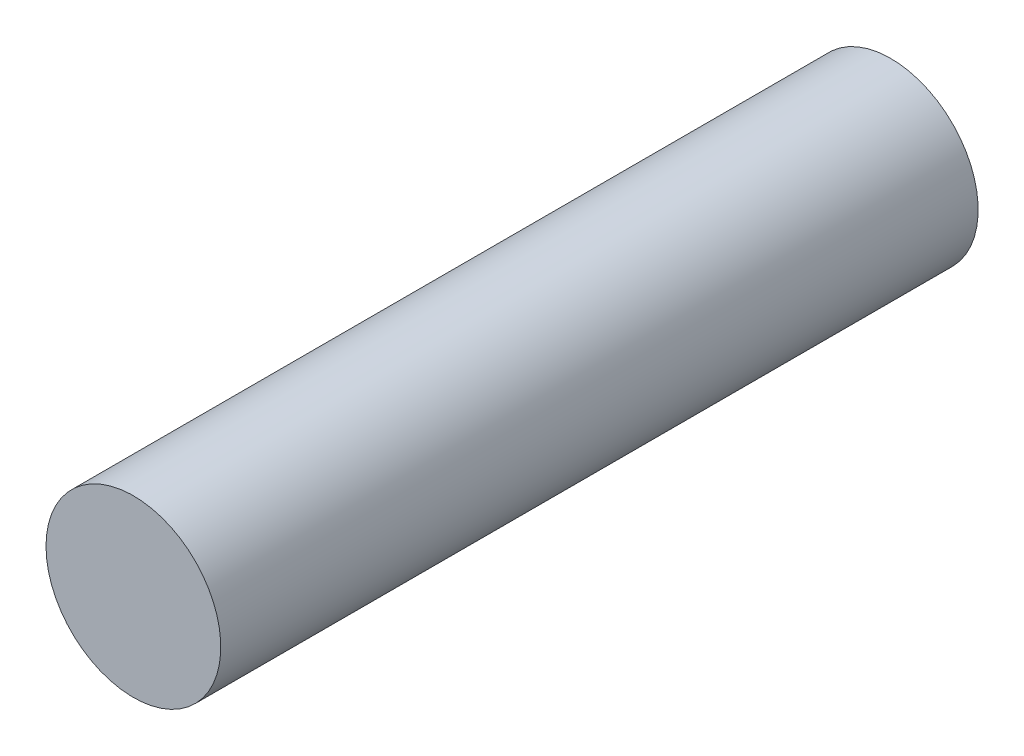
ISO-10303-21;
HEADER;
FILE_DESCRIPTION(('STEP AP214'),'2;1');
FILE_NAME('part.step','',(''),(''),'','','');
FILE_SCHEMA(('AUTOMOTIVE_DESIGN { 1 0 10303 214 1 1 1 1 }'));
ENDSEC;
DATA;
#1=APPLICATION_CONTEXT('core data for automotive mechanical design processes');
#2=APPLICATION_PROTOCOL_DEFINITION('international standard','automotive_design',2000,#1);
#3=PRODUCT_CONTEXT('',#1,'mechanical');
#4=PRODUCT('Part','Part','',(#3));
#5=PRODUCT_RELATED_PRODUCT_CATEGORY('part','',(#4));
#6=PRODUCT_DEFINITION_FORMATION('','',#4);
#7=PRODUCT_DEFINITION_CONTEXT('part definition',#1,'design');
#8=PRODUCT_DEFINITION('design','',#6,#7);
#9=PRODUCT_DEFINITION_SHAPE('','',#8);
#10=(LENGTH_UNIT() NAMED_UNIT(*) SI_UNIT(.MILLI.,.METRE.));
#11=(NAMED_UNIT(*) PLANE_ANGLE_UNIT() SI_UNIT($,.RADIAN.));
#12=(NAMED_UNIT(*) SI_UNIT($,.STERADIAN.) SOLID_ANGLE_UNIT());
#13=UNCERTAINTY_MEASURE_WITH_UNIT(LENGTH_MEASURE(1.E-05),#10,'distance_accuracy_value','');
#14=(GEOMETRIC_REPRESENTATION_CONTEXT(3) GLOBAL_UNCERTAINTY_ASSIGNED_CONTEXT((#13)) GLOBAL_UNIT_ASSIGNED_CONTEXT((#10,
#11,#12)) REPRESENTATION_CONTEXT('',''));
#15=CARTESIAN_POINT('',(0.,0.,0.));
#16=DIRECTION('',(0.,0.,1.));
#17=DIRECTION('',(1.,0.,0.));
#18=AXIS2_PLACEMENT_3D('',#15,#16,#17);
#19=CARTESIAN_POINT('',(0.,0.,165.1));
#20=DIRECTION('',(0.,0.,-1.));
#21=DIRECTION('',(-1.,0.,0.));
#22=AXIS2_PLACEMENT_3D('',#19,#20,#21);
#23=CYLINDRICAL_SURFACE('',#22,19.05);
#24=CARTESIAN_POINT('',(0.,0.,165.1));
#25=DIRECTION('',(0.,0.,1.));
#26=DIRECTION('',(1.,0.,0.));
#27=AXIS2_PLACEMENT_3D('',#24,#25,#26);
#28=CIRCLE('',#27,19.05);
#29=CARTESIAN_POINT('',(-19.05,0.,165.1));
#30=VERTEX_POINT('',#29);
#31=EDGE_CURVE('E10',#30,#30,#28,.T.);
#32=CARTESIAN_POINT('',(0.,0.,0.));
#33=DIRECTION('',(0.,0.,1.));
#34=DIRECTION('',(1.,0.,0.));
#35=AXIS2_PLACEMENT_3D('',#32,#33,#34);
#36=CIRCLE('',#35,19.05);
#37=CARTESIAN_POINT('',(-19.05,0.,0.));
#38=VERTEX_POINT('',#37);
#39=EDGE_CURVE('E38',#38,#38,#36,.T.);
#40=CARTESIAN_POINT('',(-19.05,0.,165.1));
#41=CARTESIAN_POINT('',(-19.05,0.,163.380208333333));
#42=CARTESIAN_POINT('',(-19.05,0.,161.660416666667));
#43=CARTESIAN_POINT('',(-19.05,0.,158.220833333333));
#44=CARTESIAN_POINT('',(-19.05,0.,156.501041666667));
#45=CARTESIAN_POINT('',(-19.05,0.,153.061458333333));
#46=CARTESIAN_POINT('',(-19.05,0.,151.341666666667));
#47=CARTESIAN_POINT('',(-19.05,0.,147.902083333333));
#48=CARTESIAN_POINT('',(-19.05,0.,146.182291666667));
#49=CARTESIAN_POINT('',(-19.05,0.,142.742708333333));
#50=CARTESIAN_POINT('',(-19.05,0.,141.022916666667));
#51=CARTESIAN_POINT('',(-19.05,0.,137.583333333333));
#52=CARTESIAN_POINT('',(-19.05,0.,135.863541666667));
#53=CARTESIAN_POINT('',(-19.05,0.,132.423958333333));
#54=CARTESIAN_POINT('',(-19.05,0.,130.704166666667));
#55=CARTESIAN_POINT('',(-19.05,0.,127.264583333333));
#56=CARTESIAN_POINT('',(-19.05,0.,125.544791666667));
#57=CARTESIAN_POINT('',(-19.05,0.,122.105208333333));
#58=CARTESIAN_POINT('',(-19.05,0.,120.385416666667));
#59=CARTESIAN_POINT('',(-19.05,0.,116.945833333333));
#60=CARTESIAN_POINT('',(-19.05,0.,115.226041666667));
#61=CARTESIAN_POINT('',(-19.05,0.,111.786458333333));
#62=CARTESIAN_POINT('',(-19.05,0.,110.066666666667));
#63=CARTESIAN_POINT('',(-19.05,0.,106.627083333333));
#64=CARTESIAN_POINT('',(-19.05,0.,104.907291666667));
#65=CARTESIAN_POINT('',(-19.05,0.,101.467708333333));
#66=CARTESIAN_POINT('',(-19.05,0.,99.7479166666666));
#67=CARTESIAN_POINT('',(-19.05,0.,96.3083333333333));
#68=CARTESIAN_POINT('',(-19.05,0.,94.5885416666666));
#69=CARTESIAN_POINT('',(-19.05,0.,91.1489583333333));
#70=CARTESIAN_POINT('',(-19.05,0.,89.4291666666666));
#71=CARTESIAN_POINT('',(-19.05,0.,85.9895833333333));
#72=CARTESIAN_POINT('',(-19.05,0.,84.2697916666666));
#73=CARTESIAN_POINT('',(-19.05,0.,80.8302083333333));
#74=CARTESIAN_POINT('',(-19.05,0.,79.1104166666666));
#75=CARTESIAN_POINT('',(-19.05,0.,75.6708333333333));
#76=CARTESIAN_POINT('',(-19.05,0.,73.9510416666666));
#77=CARTESIAN_POINT('',(-19.05,0.,70.5114583333333));
#78=CARTESIAN_POINT('',(-19.05,0.,68.7916666666666));
#79=CARTESIAN_POINT('',(-19.05,0.,65.3520833333333));
#80=CARTESIAN_POINT('',(-19.05,0.,63.6322916666666));
#81=CARTESIAN_POINT('',(-19.05,0.,60.1927083333333));
#82=CARTESIAN_POINT('',(-19.05,0.,58.4729166666666));
#83=CARTESIAN_POINT('',(-19.05,0.,55.0333333333333));
#84=CARTESIAN_POINT('',(-19.05,0.,53.3135416666666));
#85=CARTESIAN_POINT('',(-19.05,0.,49.8739583333333));
#86=CARTESIAN_POINT('',(-19.05,0.,48.1541666666666));
#87=CARTESIAN_POINT('',(-19.05,0.,44.7145833333333));
#88=CARTESIAN_POINT('',(-19.05,0.,42.9947916666667));
#89=CARTESIAN_POINT('',(-19.05,0.,39.5552083333333));
#90=CARTESIAN_POINT('',(-19.05,0.,37.8354166666666));
#91=CARTESIAN_POINT('',(-19.05,0.,34.3958333333333));
#92=CARTESIAN_POINT('',(-19.05,0.,32.6760416666667));
#93=CARTESIAN_POINT('',(-19.05,0.,29.2364583333333));
#94=CARTESIAN_POINT('',(-19.05,0.,27.5166666666667));
#95=CARTESIAN_POINT('',(-19.05,0.,24.0770833333333));
#96=CARTESIAN_POINT('',(-19.05,0.,22.3572916666667));
#97=CARTESIAN_POINT('',(-19.05,0.,18.9177083333333));
#98=CARTESIAN_POINT('',(-19.05,0.,17.1979166666667));
#99=CARTESIAN_POINT('',(-19.05,0.,13.7583333333333));
#100=CARTESIAN_POINT('',(-19.05,0.,12.0385416666667));
#101=CARTESIAN_POINT('',(-19.05,0.,8.59895833333332));
#102=CARTESIAN_POINT('',(-19.05,0.,6.87916666666666));
#103=CARTESIAN_POINT('',(-19.05,0.,3.43958333333333));
#104=CARTESIAN_POINT('',(-19.05,0.,1.71979166666666));
#105=CARTESIAN_POINT('',(-19.05,0.,0.));
#106=B_SPLINE_CURVE_WITH_KNOTS('',3,(#40,#41,#42,#43,#44,#45,#46,#47,#48,#49,#50,#51,#52,#53,
#54,#55,#56,#57,#58,#59,#60,#61,#62,#63,#64,#65,#66,#67,#68,#69,#70,#71,#72,#73,#74,#75,#76,#77,
#78,#79,#80,#81,#82,#83,#84,#85,#86,#87,#88,#89,#90,#91,#92,#93,#94,#95,#96,#97,#98,#99,#100,
#101,#102,#103,#104,#105),.UNSPECIFIED.,.F.,.F.,(4,2,2,2,2,2,2,2,2,2,2,2,2,2,2,2,2,2,2,2,2,2,2,
2,2,2,2,2,2,2,2,2,4),(0.,5.15937499999999,10.31875,15.478125,20.6375,25.796875,30.95625,
36.115625,41.275,46.434375,51.59375,56.753125,61.9125,67.0718749999999,72.2312499999999,
77.3906249999999,82.5499999999999,87.7093749999999,92.8687499999999,98.0281249999999,103.1875,
108.346875,113.50625,118.665625,123.825,128.984375,134.14375,139.303125,144.4625,149.621875,
154.78125,159.940625,165.1),.UNSPECIFIED.);
#107=EDGE_CURVE('BSEAM35',#30,#38,#106,.T.);
#108=ORIENTED_EDGE('',*,*,#31,.F.);
#109=ORIENTED_EDGE('',*,*,#39,.T.);
#110=ORIENTED_EDGE('',*,*,#107,.T.);
#111=ORIENTED_EDGE('',*,*,#107,.F.);
#112=EDGE_LOOP('',(#108,#110,#109,#111));
#113=FACE_BOUND('',#112,.T.);
#114=ADVANCED_FACE('F35',(#113),#23,.T.);
#115=CARTESIAN_POINT('',(0.,0.,165.1));
#116=DIRECTION('',(0.,0.,1.));
#117=DIRECTION('',(1.,0.,0.));
#118=AXIS2_PLACEMENT_3D('',#115,#116,#117);
#119=PLANE('',#118);
#120=ORIENTED_EDGE('',*,*,#31,.T.);
#121=EDGE_LOOP('',(#120));
#122=FACE_BOUND('',#121,.T.);
#123=ADVANCED_FACE('F50',(#122),#119,.T.);
#124=CARTESIAN_POINT('',(0.,0.,0.));
#125=DIRECTION('',(0.,0.,1.));
#126=DIRECTION('',(1.,0.,0.));
#127=AXIS2_PLACEMENT_3D('',#124,#125,#126);
#128=PLANE('',#127);
#129=ORIENTED_EDGE('',*,*,#39,.F.);
#130=EDGE_LOOP('',(#129));
#131=FACE_BOUND('',#130,.T.);
#132=ADVANCED_FACE('F48',(#131),#128,.F.);
#133=CLOSED_SHELL('',(#114,#123,#132));
#134=MANIFOLD_SOLID_BREP('B2',#133);
#135=ADVANCED_BREP_SHAPE_REPRESENTATION('',(#18,#134),#14);
#136=SHAPE_DEFINITION_REPRESENTATION(#9,#135);
ENDSEC;
END-ISO-10303-21;
